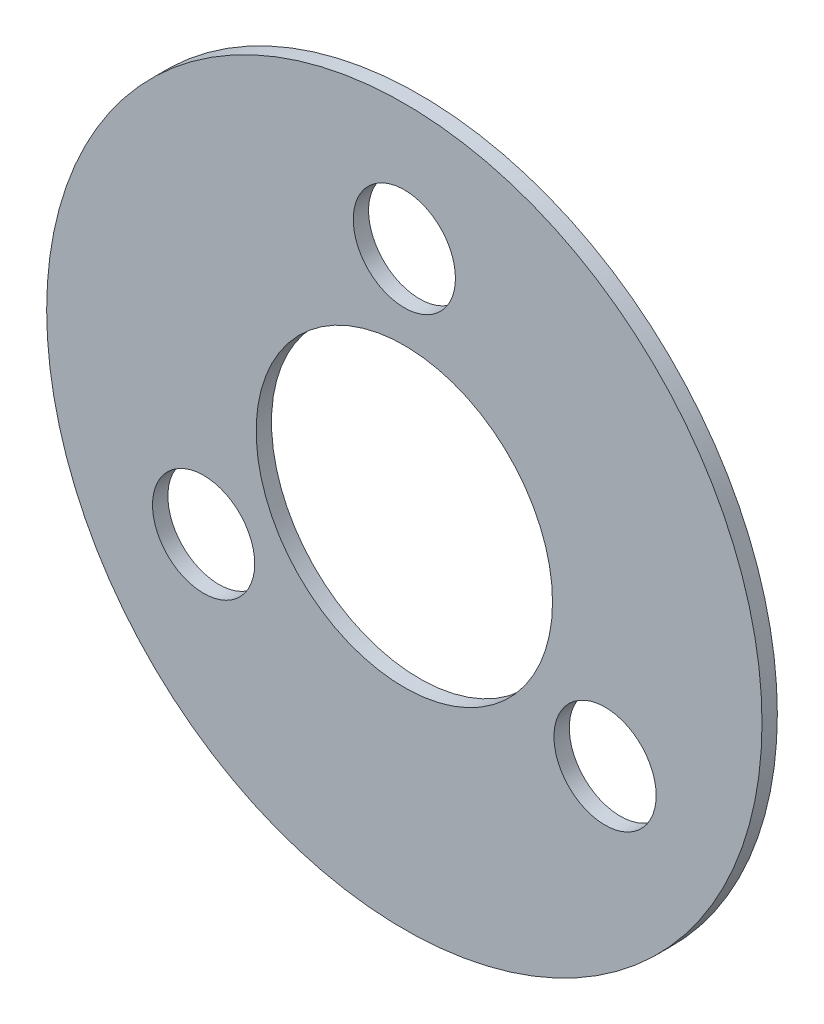
ISO-10303-21;
HEADER;
FILE_DESCRIPTION(('STEP AP214'),'2;1');
FILE_NAME('part.step','',(''),(''),'','','');
FILE_SCHEMA(('AUTOMOTIVE_DESIGN { 1 0 10303 214 1 1 1 1 }'));
ENDSEC;
DATA;
#1=APPLICATION_CONTEXT('core data for automotive mechanical design processes');
#2=APPLICATION_PROTOCOL_DEFINITION('international standard','automotive_design',2000,#1);
#3=PRODUCT_CONTEXT('',#1,'mechanical');
#4=PRODUCT('Part','Part','',(#3));
#5=PRODUCT_RELATED_PRODUCT_CATEGORY('part','',(#4));
#6=PRODUCT_DEFINITION_FORMATION('','',#4);
#7=PRODUCT_DEFINITION_CONTEXT('part definition',#1,'design');
#8=PRODUCT_DEFINITION('design','',#6,#7);
#9=PRODUCT_DEFINITION_SHAPE('','',#8);
#10=(LENGTH_UNIT() NAMED_UNIT(*) SI_UNIT(.MILLI.,.METRE.));
#11=(NAMED_UNIT(*) PLANE_ANGLE_UNIT() SI_UNIT($,.RADIAN.));
#12=(NAMED_UNIT(*) SI_UNIT($,.STERADIAN.) SOLID_ANGLE_UNIT());
#13=UNCERTAINTY_MEASURE_WITH_UNIT(LENGTH_MEASURE(1.E-05),#10,'distance_accuracy_value','');
#14=(GEOMETRIC_REPRESENTATION_CONTEXT(3) GLOBAL_UNCERTAINTY_ASSIGNED_CONTEXT((#13)) GLOBAL_UNIT_ASSIGNED_CONTEXT((#10,
#11,#12)) REPRESENTATION_CONTEXT('',''));
#15=CARTESIAN_POINT('',(0.,0.,0.));
#16=DIRECTION('',(0.,0.,1.));
#17=DIRECTION('',(1.,0.,0.));
#18=AXIS2_PLACEMENT_3D('',#15,#16,#17);
#19=CARTESIAN_POINT('',(0.,0.,3.));
#20=DIRECTION('',(0.,0.,1.));
#21=DIRECTION('',(1.,0.,0.));
#22=AXIS2_PLACEMENT_3D('',#19,#20,#21);
#23=PLANE('',#22);
#24=CARTESIAN_POINT('',(39.2803142394537,-22.6784999999983,3.));
#25=DIRECTION('',(0.,0.,1.));
#26=DIRECTION('',(1.,0.,0.));
#27=AXIS2_PLACEMENT_3D('',#24,#25,#26);
#28=CIRCLE('',#27,10.0000000000025);
#29=CARTESIAN_POINT('',(49.2803142394562,-22.6784999999983,3.));
#30=VERTEX_POINT('',#29);
#31=EDGE_CURVE('E65',#30,#30,#28,.T.);
#32=ORIENTED_EDGE('',*,*,#31,.F.);
#33=EDGE_LOOP('',(#32));
#34=FACE_BOUND('',#33,.T.);
#35=CARTESIAN_POINT('',(-39.2803142394479,-22.6785000000017,3.));
#36=DIRECTION('',(0.,0.,1.));
#37=DIRECTION('',(1.,0.,0.));
#38=AXIS2_PLACEMENT_3D('',#35,#36,#37);
#39=CIRCLE('',#38,10.0000000000037);
#40=CARTESIAN_POINT('',(-29.2803142394442,-22.6785000000017,3.));
#41=VERTEX_POINT('',#40);
#42=EDGE_CURVE('E59',#41,#41,#39,.T.);
#43=ORIENTED_EDGE('',*,*,#42,.F.);
#44=EDGE_LOOP('',(#43));
#45=FACE_BOUND('',#44,.T.);
#46=CARTESIAN_POINT('',(0.,45.357,3.));
#47=DIRECTION('',(0.,0.,1.));
#48=DIRECTION('',(1.,0.,0.));
#49=AXIS2_PLACEMENT_3D('',#46,#47,#48);
#50=CIRCLE('',#49,10.);
#51=CARTESIAN_POINT('',(10.,45.357,3.));
#52=VERTEX_POINT('',#51);
#53=EDGE_CURVE('E53',#52,#52,#50,.T.);
#54=ORIENTED_EDGE('',*,*,#53,.F.);
#55=EDGE_LOOP('',(#54));
#56=FACE_BOUND('',#55,.T.);
#57=CARTESIAN_POINT('',(0.,0.,3.));
#58=DIRECTION('',(0.,0.,1.));
#59=DIRECTION('',(1.,0.,0.));
#60=AXIS2_PLACEMENT_3D('',#57,#58,#59);
#61=CIRCLE('',#60,70.);
#62=CARTESIAN_POINT('',(70.,0.,3.));
#63=VERTEX_POINT('',#62);
#64=EDGE_CURVE('E10',#63,#63,#61,.T.);
#65=ORIENTED_EDGE('',*,*,#64,.T.);
#66=EDGE_LOOP('',(#65));
#67=FACE_BOUND('',#66,.T.);
#68=CARTESIAN_POINT('',(0.,0.,3.));
#69=DIRECTION('',(0.,0.,1.));
#70=DIRECTION('',(1.,0.,0.));
#71=AXIS2_PLACEMENT_3D('',#68,#69,#70);
#72=CIRCLE('',#71,29.);
#73=CARTESIAN_POINT('',(29.,0.,3.));
#74=VERTEX_POINT('',#73);
#75=EDGE_CURVE('E45',#74,#74,#72,.T.);
#76=ORIENTED_EDGE('',*,*,#75,.F.);
#77=EDGE_LOOP('',(#76));
#78=FACE_BOUND('',#77,.T.);
#79=ADVANCED_FACE('F34',(#34,#45,#56,#67,#78),#23,.T.);
#80=CARTESIAN_POINT('',(0.,0.,0.));
#81=DIRECTION('',(0.,0.,1.));
#82=DIRECTION('',(1.,0.,0.));
#83=AXIS2_PLACEMENT_3D('',#80,#81,#82);
#84=PLANE('',#83);
#85=CARTESIAN_POINT('',(39.2803142394537,-22.6784999999983,0.));
#86=DIRECTION('',(0.,0.,1.));
#87=DIRECTION('',(1.,0.,0.));
#88=AXIS2_PLACEMENT_3D('',#85,#86,#87);
#89=CIRCLE('',#88,10.0000000000025);
#90=CARTESIAN_POINT('',(49.2803142394562,-22.6784999999983,0.));
#91=VERTEX_POINT('',#90);
#92=EDGE_CURVE('E56',#91,#91,#89,.T.);
#93=ORIENTED_EDGE('',*,*,#92,.T.);
#94=EDGE_LOOP('',(#93));
#95=FACE_BOUND('',#94,.T.);
#96=CARTESIAN_POINT('',(-39.2803142394479,-22.6785000000017,0.));
#97=DIRECTION('',(0.,0.,1.));
#98=DIRECTION('',(1.,0.,0.));
#99=AXIS2_PLACEMENT_3D('',#96,#97,#98);
#100=CIRCLE('',#99,10.0000000000037);
#101=CARTESIAN_POINT('',(-29.2803142394442,-22.6785000000017,0.));
#102=VERTEX_POINT('',#101);
#103=EDGE_CURVE('E62',#102,#102,#100,.T.);
#104=ORIENTED_EDGE('',*,*,#103,.T.);
#105=EDGE_LOOP('',(#104));
#106=FACE_BOUND('',#105,.T.);
#107=CARTESIAN_POINT('',(0.,45.357,0.));
#108=DIRECTION('',(0.,0.,1.));
#109=DIRECTION('',(1.,0.,0.));
#110=AXIS2_PLACEMENT_3D('',#107,#108,#109);
#111=CIRCLE('',#110,10.);
#112=CARTESIAN_POINT('',(10.,45.357,0.));
#113=VERTEX_POINT('',#112);
#114=EDGE_CURVE('E50',#113,#113,#111,.T.);
#115=ORIENTED_EDGE('',*,*,#114,.T.);
#116=EDGE_LOOP('',(#115));
#117=FACE_BOUND('',#116,.T.);
#118=CARTESIAN_POINT('',(0.,0.,0.));
#119=DIRECTION('',(0.,0.,1.));
#120=DIRECTION('',(1.,0.,0.));
#121=AXIS2_PLACEMENT_3D('',#118,#119,#120);
#122=CIRCLE('',#121,70.);
#123=CARTESIAN_POINT('',(70.,0.,0.));
#124=VERTEX_POINT('',#123);
#125=EDGE_CURVE('E38',#124,#124,#122,.T.);
#126=ORIENTED_EDGE('',*,*,#125,.F.);
#127=EDGE_LOOP('',(#126));
#128=FACE_BOUND('',#127,.T.);
#129=CARTESIAN_POINT('',(0.,0.,0.));
#130=DIRECTION('',(0.,0.,1.));
#131=DIRECTION('',(1.,0.,0.));
#132=AXIS2_PLACEMENT_3D('',#129,#130,#131);
#133=CIRCLE('',#132,29.);
#134=CARTESIAN_POINT('',(29.,0.,0.));
#135=VERTEX_POINT('',#134);
#136=EDGE_CURVE('E47',#135,#135,#133,.T.);
#137=ORIENTED_EDGE('',*,*,#136,.T.);
#138=EDGE_LOOP('',(#137));
#139=FACE_BOUND('',#138,.T.);
#140=ADVANCED_FACE('F71',(#95,#106,#117,#128,#139),#84,.F.);
#141=CARTESIAN_POINT('',(0.,0.,3.));
#142=DIRECTION('',(0.,0.,-1.));
#143=DIRECTION('',(-1.,0.,0.));
#144=AXIS2_PLACEMENT_3D('',#141,#142,#143);
#145=CYLINDRICAL_SURFACE('',#144,70.);
#146=ORIENTED_EDGE('',*,*,#64,.F.);
#147=EDGE_LOOP('',(#146));
#148=FACE_BOUND('',#147,.T.);
#149=ORIENTED_EDGE('',*,*,#125,.T.);
#150=EDGE_LOOP('',(#149));
#151=FACE_BOUND('',#150,.T.);
#152=ADVANCED_FACE('F36',(#148,#151),#145,.T.);
#153=CARTESIAN_POINT('',(0.,0.,3.));
#154=DIRECTION('',(0.,0.,-1.));
#155=DIRECTION('',(-1.,0.,0.));
#156=AXIS2_PLACEMENT_3D('',#153,#154,#155);
#157=CYLINDRICAL_SURFACE('',#156,29.);
#158=ORIENTED_EDGE('',*,*,#75,.T.);
#159=EDGE_LOOP('',(#158));
#160=FACE_BOUND('',#159,.T.);
#161=ORIENTED_EDGE('',*,*,#136,.F.);
#162=EDGE_LOOP('',(#161));
#163=FACE_BOUND('',#162,.T.);
#164=ADVANCED_FACE('F90',(#160,#163),#157,.F.);
#165=CARTESIAN_POINT('',(0.,45.357,0.));
#166=DIRECTION('',(0.,0.,1.));
#167=DIRECTION('',(1.,0.,0.));
#168=AXIS2_PLACEMENT_3D('',#165,#166,#167);
#169=CYLINDRICAL_SURFACE('',#168,10.);
#170=ORIENTED_EDGE('',*,*,#114,.F.);
#171=EDGE_LOOP('',(#170));
#172=FACE_BOUND('',#171,.T.);
#173=ORIENTED_EDGE('',*,*,#53,.T.);
#174=EDGE_LOOP('',(#173));
#175=FACE_BOUND('',#174,.T.);
#176=ADVANCED_FACE('F93',(#172,#175),#169,.F.);
#177=CARTESIAN_POINT('',(-39.2803142394479,-22.6785000000017,0.));
#178=DIRECTION('',(0.,0.,1.));
#179=DIRECTION('',(1.,0.,0.));
#180=AXIS2_PLACEMENT_3D('',#177,#178,#179);
#181=CYLINDRICAL_SURFACE('',#180,10.0000000000037);
#182=ORIENTED_EDGE('',*,*,#103,.F.);
#183=EDGE_LOOP('',(#182));
#184=FACE_BOUND('',#183,.T.);
#185=ORIENTED_EDGE('',*,*,#42,.T.);
#186=EDGE_LOOP('',(#185));
#187=FACE_BOUND('',#186,.T.);
#188=ADVANCED_FACE('F77',(#184,#187),#181,.F.);
#189=CARTESIAN_POINT('',(39.2803142394537,-22.6784999999983,0.));
#190=DIRECTION('',(0.,0.,1.));
#191=DIRECTION('',(1.,0.,0.));
#192=AXIS2_PLACEMENT_3D('',#189,#190,#191);
#193=CYLINDRICAL_SURFACE('',#192,10.0000000000025);
#194=ORIENTED_EDGE('',*,*,#92,.F.);
#195=EDGE_LOOP('',(#194));
#196=FACE_BOUND('',#195,.T.);
#197=ORIENTED_EDGE('',*,*,#31,.T.);
#198=EDGE_LOOP('',(#197));
#199=FACE_BOUND('',#198,.T.);
#200=ADVANCED_FACE('F74',(#196,#199),#193,.F.);
#201=CLOSED_SHELL('',(#79,#140,#152,#164,#176,#188,#200));
#202=MANIFOLD_SOLID_BREP('B2',#201);
#203=ADVANCED_BREP_SHAPE_REPRESENTATION('',(#18,#202),#14);
#204=SHAPE_DEFINITION_REPRESENTATION(#9,#203);
ENDSEC;
END-ISO-10303-21;
